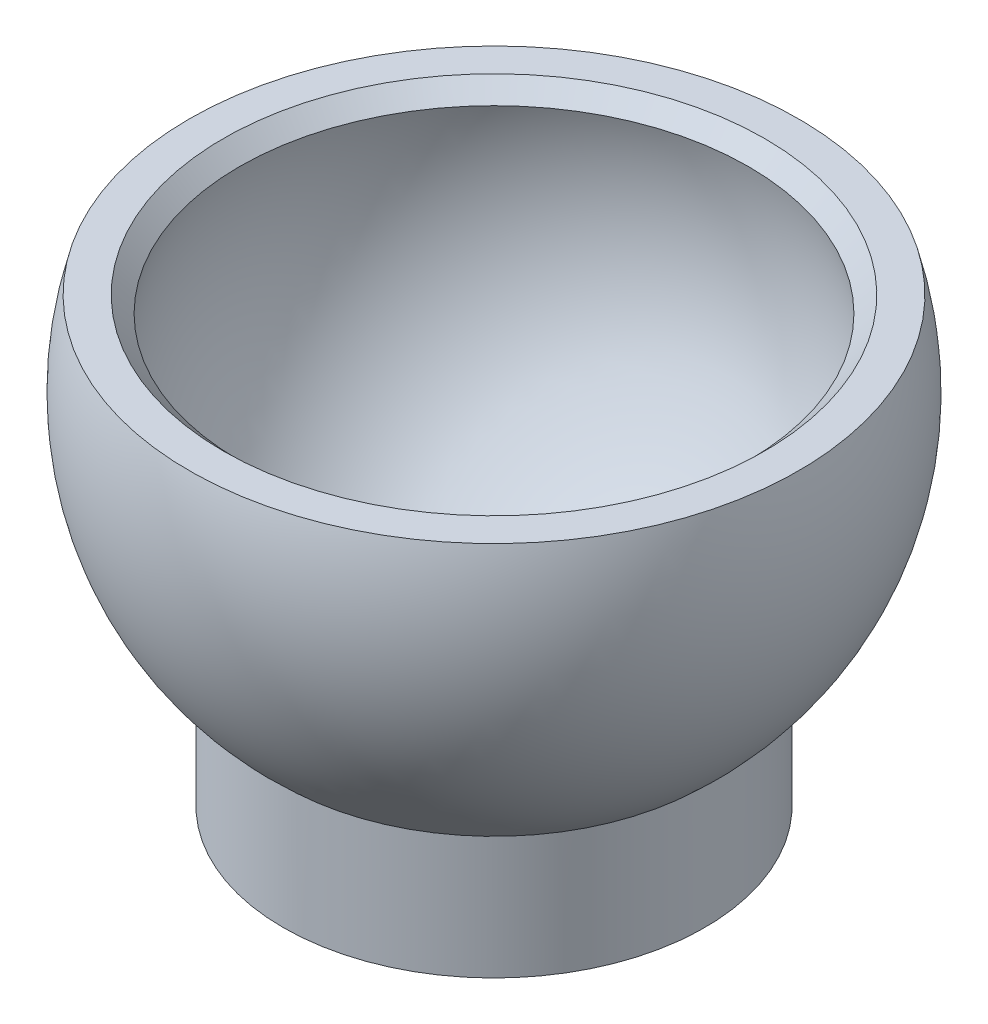
ISO-10303-21;
HEADER;
FILE_DESCRIPTION(('STEP AP214'),'2;1');
FILE_NAME('part.step','',(''),(''),'','','');
FILE_SCHEMA(('AUTOMOTIVE_DESIGN { 1 0 10303 214 1 1 1 1 }'));
ENDSEC;
DATA;
#1=APPLICATION_CONTEXT('core data for automotive mechanical design processes');
#2=APPLICATION_PROTOCOL_DEFINITION('international standard','automotive_design',2000,#1);
#3=PRODUCT_CONTEXT('',#1,'mechanical');
#4=PRODUCT('Part','Part','',(#3));
#5=PRODUCT_RELATED_PRODUCT_CATEGORY('part','',(#4));
#6=PRODUCT_DEFINITION_FORMATION('','',#4);
#7=PRODUCT_DEFINITION_CONTEXT('part definition',#1,'design');
#8=PRODUCT_DEFINITION('design','',#6,#7);
#9=PRODUCT_DEFINITION_SHAPE('','',#8);
#10=(LENGTH_UNIT() NAMED_UNIT(*) SI_UNIT(.MILLI.,.METRE.));
#11=(NAMED_UNIT(*) PLANE_ANGLE_UNIT() SI_UNIT($,.RADIAN.));
#12=(NAMED_UNIT(*) SI_UNIT($,.STERADIAN.) SOLID_ANGLE_UNIT());
#13=UNCERTAINTY_MEASURE_WITH_UNIT(LENGTH_MEASURE(1.E-05),#10,'distance_accuracy_value','');
#14=(GEOMETRIC_REPRESENTATION_CONTEXT(3) GLOBAL_UNCERTAINTY_ASSIGNED_CONTEXT((#13)) GLOBAL_UNIT_ASSIGNED_CONTEXT((#10,
#11,#12)) REPRESENTATION_CONTEXT('',''));
#15=CARTESIAN_POINT('',(0.,0.,0.));
#16=DIRECTION('',(0.,0.,1.));
#17=DIRECTION('',(1.,0.,0.));
#18=AXIS2_PLACEMENT_3D('',#15,#16,#17);
#19=CARTESIAN_POINT('',(0.,0.,0.));
#20=DIRECTION('',(0.,1.,0.));
#21=DIRECTION('',(-1.,0.,0.));
#22=AXIS2_PLACEMENT_3D('',#19,#20,#21);
#23=SPHERICAL_SURFACE('',#22,15.);
#24=CARTESIAN_POINT('',(0.,4.,0.));
#25=DIRECTION('',(0.,1.,0.));
#26=DIRECTION('',(0.,0.,1.));
#27=AXIS2_PLACEMENT_3D('',#24,#25,#26);
#28=CIRCLE('',#27,14.456832294801);
#29=CARTESIAN_POINT('',(-14.456832294801,4.,0.));
#30=VERTEX_POINT('',#29);
#31=EDGE_CURVE('E51',#30,#30,#28,.T.);
#32=CARTESIAN_POINT('',(0.,-11.1803398874989,0.));
#33=DIRECTION('',(0.,1.,0.));
#34=DIRECTION('',(0.,0.,1.));
#35=AXIS2_PLACEMENT_3D('',#32,#33,#34);
#36=CIRCLE('',#35,10.);
#37=CARTESIAN_POINT('',(-10.,-11.180339887499,0.));
#38=VERTEX_POINT('',#37);
#39=EDGE_CURVE('E47',#38,#38,#36,.F.);
#40=CARTESIAN_POINT('',(-14.456832294801,4.,0.));
#41=CARTESIAN_POINT('',(-14.5031252907453,3.832692369119,0.));
#42=CARTESIAN_POINT('',(-14.5465114327012,3.66458053443365,0.));
#43=CARTESIAN_POINT('',(-14.627423287205,3.32695241325734,0.));
#44=CARTESIAN_POINT('',(-14.6649489997529,3.15743612676638,0.));
#45=CARTESIAN_POINT('',(-14.7340932740093,2.81720305778196,0.));
#46=CARTESIAN_POINT('',(-14.7657118357179,2.64648627528849,0.));
#47=CARTESIAN_POINT('',(-14.8230040992361,2.3040580705991,0.));
#48=CARTESIAN_POINT('',(-14.8486778010457,2.13234664840318,0.));
#49=CARTESIAN_POINT('',(-14.894049293759,1.78813609788811,0.));
#50=CARTESIAN_POINT('',(-14.9137470846626,1.61563696956897,0.));
#51=CARTESIAN_POINT('',(-14.9471430430503,1.27005892235308,0.));
#52=CARTESIAN_POINT('',(-14.9608412105344,1.09698000345634,0.));
#53=CARTESIAN_POINT('',(-14.9822214043475,0.750450980711471,0.));
#54=CARTESIAN_POINT('',(-14.9899034306765,0.577000876863348,0.));
#55=CARTESIAN_POINT('',(-14.9992420852968,0.22993853955946,0.));
#56=CARTESIAN_POINT('',(-15.0008987135881,0.0563263061036952,0.));
#57=CARTESIAN_POINT('',(-14.9981845748901,-0.290851040287665,0.));
#58=CARTESIAN_POINT('',(-14.9938138079008,-0.464416153223259,0.));
#59=CARTESIAN_POINT('',(-14.97905014676,-0.811290065071728,0.));
#60=CARTESIAN_POINT('',(-14.9686572526086,-0.984598863984602,0.));
#61=CARTESIAN_POINT('',(-14.941861863386,-1.33075126325861,0.));
#62=CARTESIAN_POINT('',(-14.9254593683148,-1.50359486361974,0.));
#63=CARTESIAN_POINT('',(-14.8866645467595,-1.84860854194077,0.));
#64=CARTESIAN_POINT('',(-14.8642722202753,-2.02077861990067,0.));
#65=CARTESIAN_POINT('',(-14.8135247247735,-2.36423774135182,0.));
#66=CARTESIAN_POINT('',(-14.7851695557557,-2.53552678484307,0.));
#67=CARTESIAN_POINT('',(-14.7225305509272,-2.87701738717632,0.));
#68=CARTESIAN_POINT('',(-14.6882467151164,-3.04721894601831,0.));
#69=CARTESIAN_POINT('',(-14.6137916981074,-3.38632943958933,0.));
#70=CARTESIAN_POINT('',(-14.5736205169092,-3.55523837431835,0.));
#71=CARTESIAN_POINT('',(-14.4874392263938,-3.89156003816551,0.));
#72=CARTESIAN_POINT('',(-14.4414291170767,-4.05897276728363,0.));
#73=CARTESIAN_POINT('',(-14.3436254250986,-4.39210024174837,0.));
#74=CARTESIAN_POINT('',(-14.2918318424376,-4.55781498709498,0.));
#75=CARTESIAN_POINT('',(-14.1825236292151,-4.88734676239125,0.));
#76=CARTESIAN_POINT('',(-14.1250089986536,-5.05116379234091,0.));
#77=CARTESIAN_POINT('',(-14.0043280105021,-5.37670269248429,0.));
#78=CARTESIAN_POINT('',(-13.9411616529121,-5.53842456267801,0.));
#79=CARTESIAN_POINT('',(-13.8092533434535,-5.85957822419165,0.));
#80=CARTESIAN_POINT('',(-13.740511391585,-6.01901001551158,0.));
#81=CARTESIAN_POINT('',(-13.5975347464362,-6.33539136033094,0.));
#82=CARTESIAN_POINT('',(-13.5233000531559,-6.49234091383037,0.));
#83=CARTESIAN_POINT('',(-13.3694273983095,-6.80356861584069,0.));
#84=CARTESIAN_POINT('',(-13.2897894367433,-6.95784676435157,0.));
#85=CARTESIAN_POINT('',(-13.1252062308588,-7.26354570898094,0.));
#86=CARTESIAN_POINT('',(-13.0402609865404,-7.41496650509943,0.));
#87=CARTESIAN_POINT('',(-12.8651655974492,-7.71476824146917,0.));
#88=CARTESIAN_POINT('',(-12.7750154526763,-7.86314918172044,0.));
#89=CARTESIAN_POINT('',(-12.5896189181698,-8.15669236659997,0.));
#90=CARTESIAN_POINT('',(-12.4943725284363,-8.30185461122823,0.));
#91=CARTESIAN_POINT('',(-12.2988983023709,-8.58878544503509,0.));
#92=CARTESIAN_POINT('',(-12.1986704660391,-8.73055403421368,0.));
#93=CARTESIAN_POINT('',(-11.9933541472856,-9.01052668563795,0.));
#94=CARTESIAN_POINT('',(-11.888265664864,-9.14873074788363,0.));
#95=CARTESIAN_POINT('',(-11.6733547197921,-9.42140777743048,0.));
#96=CARTESIAN_POINT('',(-11.5635322571419,-9.55588074473164,0.));
#97=CARTESIAN_POINT('',(-11.3392856973012,-9.8209334863446,0.));
#98=CARTESIAN_POINT('',(-11.2248616001108,-9.9515132606564,0.));
#99=CARTESIAN_POINT('',(-10.991549759822,-10.2086223114634,0.));
#100=CARTESIAN_POINT('',(-10.8726620167235,-10.3351515879585,0.));
#101=CARTESIAN_POINT('',(-10.6305658922225,-10.5840068438697,0.));
#102=CARTESIAN_POINT('',(-10.5073575108199,-10.7063328232856,0.));
#103=CARTESIAN_POINT('',(-10.2567696719244,-10.94663515662,0.));
#104=CARTESIAN_POINT('',(-10.1293902144314,-11.0646115105385,0.));
#105=CARTESIAN_POINT('',(-10.,-11.180339887499,0.));
#106=B_SPLINE_CURVE_WITH_KNOTS('',3,(#40,#41,#42,#43,#44,#45,#46,#47,#48,#49,#50,#51,#52,#53,
#54,#55,#56,#57,#58,#59,#60,#61,#62,#63,#64,#65,#66,#67,#68,#69,#70,#71,#72,#73,#74,#75,#76,#77,
#78,#79,#80,#81,#82,#83,#84,#85,#86,#87,#88,#89,#90,#91,#92,#93,#94,#95,#96,#97,#98,#99,#100,
#101,#102,#103,#104,#105),.UNSPECIFIED.,.F.,.F.,(4,2,2,2,2,2,2,2,2,2,2,2,2,2,2,2,2,2,2,2,2,2,2,
2,2,2,2,2,2,2,2,2,4),(0.,0.520755781610117,1.04151156322023,1.56226734483035,2.08302312644047,
2.60377890805059,3.1245346896607,3.64529047127082,4.16604625288094,4.68680203449106,
5.20755781610117,5.72831359771129,6.24906937932141,6.76982516093152,7.29058094254164,
7.81133672415176,8.33209250576187,8.85284828737199,9.37360406898211,9.89435985059223,
10.4151156322023,10.9358714138125,11.4566271954226,11.9773829770327,12.4981387586428,
13.0188945402529,13.539650321863,14.0604061034732,14.5811618850833,15.1019176666934,
15.6226734483035,16.1434292299136,16.6641850115237),.UNSPECIFIED.);
#107=EDGE_CURVE('BSEAM35',#30,#38,#106,.T.);
#108=ORIENTED_EDGE('',*,*,#31,.F.);
#109=ORIENTED_EDGE('',*,*,#39,.F.);
#110=ORIENTED_EDGE('',*,*,#107,.T.);
#111=ORIENTED_EDGE('',*,*,#107,.F.);
#112=EDGE_LOOP('',(#108,#110,#109,#111));
#113=FACE_BOUND('',#112,.T.);
#114=ADVANCED_FACE('F35',(#113),#23,.T.);
#115=CARTESIAN_POINT('',(0.,0.,0.));
#116=DIRECTION('',(0.,1.,0.));
#117=DIRECTION('',(1.,0.,0.));
#118=AXIS2_PLACEMENT_3D('',#115,#116,#117);
#119=SPHERICAL_SURFACE('',#118,12.5);
#120=CARTESIAN_POINT('',(0.,3.23217411282821,0.));
#121=DIRECTION('',(0.,-1.,0.));
#122=DIRECTION('',(0.,0.,-1.));
#123=AXIS2_PLACEMENT_3D('',#120,#121,#122);
#124=CIRCLE('',#123,12.0748933951552);
#125=CARTESIAN_POINT('',(0.,3.23217411282821,-12.0748933951552));
#126=VERTEX_POINT('',#125);
#127=EDGE_CURVE('E43',#126,#126,#124,.F.);
#128=ORIENTED_EDGE('',*,*,#127,.T.);
#129=EDGE_LOOP('',(#128));
#130=FACE_BOUND('',#129,.T.);
#131=ADVANCED_FACE('F74',(#130),#119,.F.);
#132=CARTESIAN_POINT('',(11.842719282327,4.,0.));
#133=DIRECTION('',(0.,-1.,0.));
#134=DIRECTION('',(0.,0.,-1.));
#135=AXIS2_PLACEMENT_3D('',#132,#133,#134);
#136=PLANE('',#135);
#137=CARTESIAN_POINT('',(0.,4.,0.));
#138=DIRECTION('',(0.,-1.,0.));
#139=DIRECTION('',(0.,0.,-1.));
#140=AXIS2_PLACEMENT_3D('',#137,#138,#139);
#141=CIRCLE('',#140,12.842719282327);
#142=CARTESIAN_POINT('',(0.,4.,-12.842719282327));
#143=VERTEX_POINT('',#142);
#144=EDGE_CURVE('E10',#143,#143,#141,.T.);
#145=ORIENTED_EDGE('',*,*,#144,.T.);
#146=EDGE_LOOP('',(#145));
#147=FACE_BOUND('',#146,.T.);
#148=ORIENTED_EDGE('',*,*,#31,.T.);
#149=EDGE_LOOP('',(#148));
#150=FACE_BOUND('',#149,.T.);
#151=ADVANCED_FACE('F71',(#147,#150),#136,.F.);
#152=CARTESIAN_POINT('',(0.,15.001,0.));
#153=DIRECTION('',(0.,-1.,0.));
#154=DIRECTION('',(0.,0.,-1.));
#155=AXIS2_PLACEMENT_3D('',#152,#153,#154);
#156=CYLINDRICAL_SURFACE('',#155,10.);
#157=CARTESIAN_POINT('',(0.,-17.,0.));
#158=DIRECTION('',(0.,1.,0.));
#159=DIRECTION('',(0.,0.,1.));
#160=AXIS2_PLACEMENT_3D('',#157,#158,#159);
#161=CIRCLE('',#160,10.);
#162=CARTESIAN_POINT('',(0.,-17.,10.));
#163=VERTEX_POINT('',#162);
#164=EDGE_CURVE('E56',#163,#163,#161,.T.);
#165=ORIENTED_EDGE('',*,*,#164,.T.);
#166=EDGE_LOOP('',(#165));
#167=FACE_BOUND('',#166,.T.);
#168=ORIENTED_EDGE('',*,*,#39,.T.);
#169=EDGE_LOOP('',(#168));
#170=FACE_BOUND('',#169,.T.);
#171=ADVANCED_FACE('F60',(#167,#170),#156,.T.);
#172=CARTESIAN_POINT('',(0.,-17.,0.));
#173=DIRECTION('',(0.,1.,0.));
#174=DIRECTION('',(0.,0.,1.));
#175=AXIS2_PLACEMENT_3D('',#172,#173,#174);
#176=PLANE('',#175);
#177=ORIENTED_EDGE('',*,*,#164,.F.);
#178=EDGE_LOOP('',(#177));
#179=FACE_BOUND('',#178,.T.);
#180=ADVANCED_FACE('F63',(#179),#176,.F.);
#181=CARTESIAN_POINT('',(0.,3.23217411282822,0.));
#182=DIRECTION('',(0.,1.,0.));
#183=DIRECTION('',(0.,0.,1.));
#184=AXIS2_PLACEMENT_3D('',#181,#182,#183);
#185=CONICAL_SURFACE('',#184,12.0748933951552,0.785398163397448);
#186=ORIENTED_EDGE('',*,*,#144,.F.);
#187=EDGE_LOOP('',(#186));
#188=FACE_BOUND('',#187,.T.);
#189=ORIENTED_EDGE('',*,*,#127,.F.);
#190=EDGE_LOOP('',(#189));
#191=FACE_BOUND('',#190,.T.);
#192=ADVANCED_FACE('F38',(#188,#191),#185,.F.);
#193=CLOSED_SHELL('',(#114,#131,#151,#171,#180,#192));
#194=MANIFOLD_SOLID_BREP('B2',#193);
#195=ADVANCED_BREP_SHAPE_REPRESENTATION('',(#18,#194),#14);
#196=SHAPE_DEFINITION_REPRESENTATION(#9,#195);
ENDSEC;
END-ISO-10303-21;
